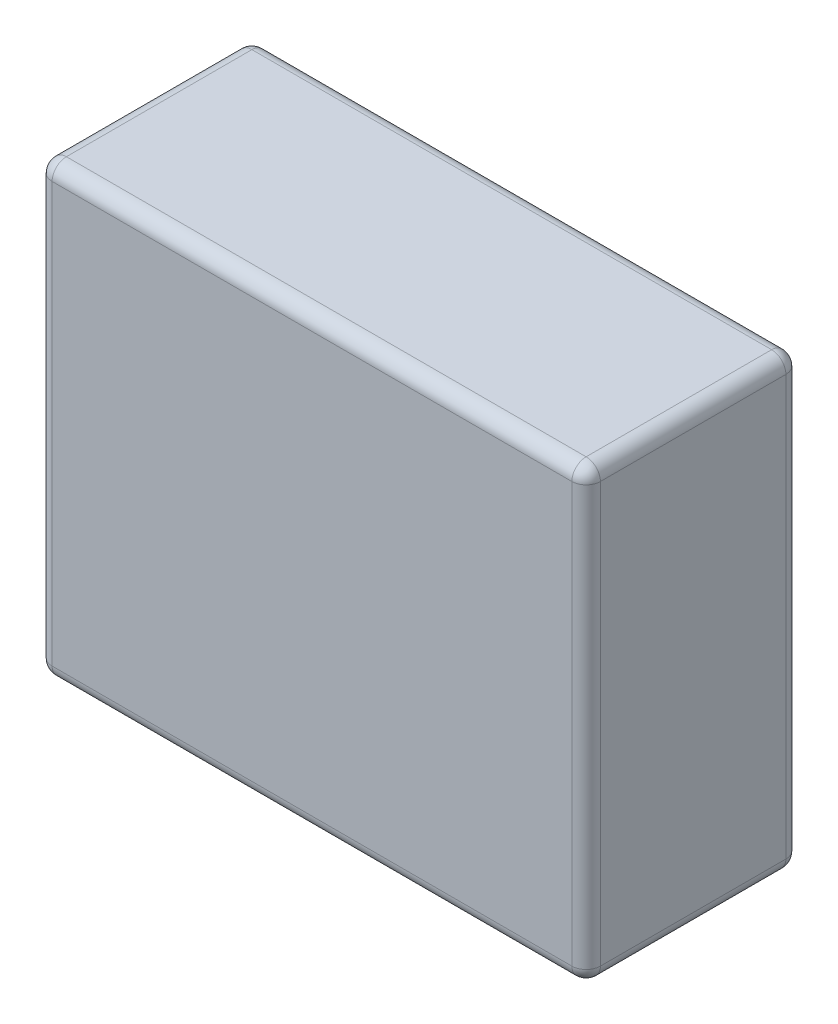
ISO-10303-21;
HEADER;
FILE_DESCRIPTION(('STEP AP214'),'2;1');
FILE_NAME('part.step','',(''),(''),'','','');
FILE_SCHEMA(('AUTOMOTIVE_DESIGN { 1 0 10303 214 1 1 1 1 }'));
ENDSEC;
DATA;
#1=APPLICATION_CONTEXT('core data for automotive mechanical design processes');
#2=APPLICATION_PROTOCOL_DEFINITION('international standard','automotive_design',2000,#1);
#3=PRODUCT_CONTEXT('',#1,'mechanical');
#4=PRODUCT('Part','Part','',(#3));
#5=PRODUCT_RELATED_PRODUCT_CATEGORY('part','',(#4));
#6=PRODUCT_DEFINITION_FORMATION('','',#4);
#7=PRODUCT_DEFINITION_CONTEXT('part definition',#1,'design');
#8=PRODUCT_DEFINITION('design','',#6,#7);
#9=PRODUCT_DEFINITION_SHAPE('','',#8);
#10=(LENGTH_UNIT() NAMED_UNIT(*) SI_UNIT(.MILLI.,.METRE.));
#11=(NAMED_UNIT(*) PLANE_ANGLE_UNIT() SI_UNIT($,.RADIAN.));
#12=(NAMED_UNIT(*) SI_UNIT($,.STERADIAN.) SOLID_ANGLE_UNIT());
#13=UNCERTAINTY_MEASURE_WITH_UNIT(LENGTH_MEASURE(1.E-05),#10,'distance_accuracy_value','');
#14=(GEOMETRIC_REPRESENTATION_CONTEXT(3) GLOBAL_UNCERTAINTY_ASSIGNED_CONTEXT((#13)) GLOBAL_UNIT_ASSIGNED_CONTEXT((#10,
#11,#12)) REPRESENTATION_CONTEXT('',''));
#15=CARTESIAN_POINT('',(0.,0.,0.));
#16=DIRECTION('',(0.,0.,1.));
#17=DIRECTION('',(1.,0.,0.));
#18=AXIS2_PLACEMENT_3D('',#15,#16,#17);
#19=CARTESIAN_POINT('',(0.,62.828734273791,30.));
#20=DIRECTION('',(1.,0.,0.));
#21=DIRECTION('',(0.,1.,0.));
#22=AXIS2_PLACEMENT_3D('',#19,#20,#21);
#23=PLANE('',#22);
#24=DIRECTION('',(0.,0.,-1.));
#25=VECTOR('',#24,1.);
#26=CARTESIAN_POINT('',(0.,2.6,2.99999999999999));
#27=LINE('',#26,#25);
#28=CARTESIAN_POINT('',(0.,2.6,2.99999999999999));
#29=VERTEX_POINT('',#28);
#30=CARTESIAN_POINT('',(0.,2.6,2.));
#31=VERTEX_POINT('',#30);
#32=EDGE_CURVE('E438',#29,#31,#27,.T.);
#33=ORIENTED_EDGE('',*,*,#32,.T.);
#34=DIRECTION('',(0.,-1.,0.));
#35=VECTOR('',#34,1.);
#36=CARTESIAN_POINT('',(0.,2.,2.));
#37=LINE('',#36,#35);
#38=CARTESIAN_POINT('',(0.,2.,2.));
#39=VERTEX_POINT('',#38);
#40=EDGE_CURVE('E327',#31,#39,#37,.T.);
#41=ORIENTED_EDGE('',*,*,#40,.T.);
#42=DIRECTION('',(0.,0.,-1.));
#43=VECTOR('',#42,1.);
#44=CARTESIAN_POINT('',(0.,2.,30.));
#45=LINE('',#44,#43);
#46=CARTESIAN_POINT('',(0.,2.,28.));
#47=VERTEX_POINT('',#46);
#48=EDGE_CURVE('E273',#39,#47,#45,.F.);
#49=ORIENTED_EDGE('',*,*,#48,.T.);
#50=DIRECTION('',(0.,-1.,0.));
#51=VECTOR('',#50,1.);
#52=CARTESIAN_POINT('',(0.,62.828734273791,28.));
#53=LINE('',#52,#51);
#54=CARTESIAN_POINT('',(0.,60.828734273791,28.));
#55=VERTEX_POINT('',#54);
#56=EDGE_CURVE('E377',#47,#55,#53,.F.);
#57=ORIENTED_EDGE('',*,*,#56,.T.);
#58=DIRECTION('',(0.,0.,-1.));
#59=VECTOR('',#58,1.);
#60=CARTESIAN_POINT('',(0.,60.828734273791,0.));
#61=LINE('',#60,#59);
#62=CARTESIAN_POINT('',(0.,60.828734273791,2.));
#63=VERTEX_POINT('',#62);
#64=EDGE_CURVE('E285',#55,#63,#61,.T.);
#65=ORIENTED_EDGE('',*,*,#64,.T.);
#66=CARTESIAN_POINT('',(0.,60.4,2.));
#67=VERTEX_POINT('',#66);
#68=EDGE_CURVE('E328',#63,#67,#37,.T.);
#69=ORIENTED_EDGE('',*,*,#68,.T.);
#70=DIRECTION('',(0.,0.,-1.));
#71=VECTOR('',#70,1.);
#72=CARTESIAN_POINT('',(0.,60.4,3.));
#73=LINE('',#72,#71);
#74=CARTESIAN_POINT('',(0.,60.4,3.));
#75=VERTEX_POINT('',#74);
#76=EDGE_CURVE('E219',#75,#67,#73,.T.);
#77=ORIENTED_EDGE('',*,*,#76,.F.);
#78=DIRECTION('',(0.,-1.,0.));
#79=VECTOR('',#78,1.);
#80=CARTESIAN_POINT('',(0.,59.,3.));
#81=LINE('',#80,#79);
#82=EDGE_CURVE('E243',#75,#29,#81,.T.);
#83=ORIENTED_EDGE('',*,*,#82,.T.);
#84=EDGE_LOOP('',(#33,#41,#49,#57,#65,#69,#77,#83));
#85=FACE_BOUND('',#84,.T.);
#86=ADVANCED_FACE('F35',(#85),#23,.F.);
#87=CARTESIAN_POINT('',(2.,62.828734273791,2.));
#88=DIRECTION('',(0.,1.,0.));
#89=DIRECTION('',(-1.,0.,0.));
#90=AXIS2_PLACEMENT_3D('',#87,#88,#89);
#91=CYLINDRICAL_SURFACE('',#90,2.);
#92=ORIENTED_EDGE('',*,*,#40,.F.);
#93=CARTESIAN_POINT('',(2.,2.6,2.));
#94=DIRECTION('',(0.,1.,0.));
#95=DIRECTION('',(0.,0.,1.));
#96=AXIS2_PLACEMENT_3D('',#93,#94,#95);
#97=CIRCLE('',#96,2.);
#98=CARTESIAN_POINT('',(0.0921215971661088,2.6,1.4));
#99=VERTEX_POINT('',#98);
#100=EDGE_CURVE('E11',#31,#99,#97,.F.);
#101=ORIENTED_EDGE('',*,*,#100,.T.);
#102=DIRECTION('',(0.,1.,0.));
#103=VECTOR('',#102,1.);
#104=CARTESIAN_POINT('',(0.0921215971661092,62.828734273791,1.4));
#105=LINE('',#104,#103);
#106=CARTESIAN_POINT('',(0.0921215971661088,4.,1.4));
#107=VERTEX_POINT('',#106);
#108=EDGE_CURVE('E223',#107,#99,#105,.F.);
#109=ORIENTED_EDGE('',*,*,#108,.F.);
#110=CARTESIAN_POINT('',(2.,4.,2.));
#111=DIRECTION('',(0.,1.,0.));
#112=DIRECTION('',(0.,0.,1.));
#113=AXIS2_PLACEMENT_3D('',#110,#111,#112);
#114=CIRCLE('',#113,2.);
#115=CARTESIAN_POINT('',(2.,4.,0.));
#116=VERTEX_POINT('',#115);
#117=EDGE_CURVE('E409',#107,#116,#114,.F.);
#118=ORIENTED_EDGE('',*,*,#117,.T.);
#119=DIRECTION('',(0.,-1.,0.));
#120=VECTOR('',#119,1.);
#121=CARTESIAN_POINT('',(2.,60.828734273791,0.));
#122=LINE('',#121,#120);
#123=CARTESIAN_POINT('',(2.,2.,0.));
#124=VERTEX_POINT('',#123);
#125=EDGE_CURVE('E321',#124,#116,#122,.F.);
#126=ORIENTED_EDGE('',*,*,#125,.F.);
#127=CARTESIAN_POINT('',(2.,2.,2.));
#128=DIRECTION('',(0.,1.,0.));
#129=DIRECTION('',(-1.,0.,0.));
#130=AXIS2_PLACEMENT_3D('',#127,#128,#129);
#131=CIRCLE('',#130,2.);
#132=EDGE_CURVE('E265',#124,#39,#131,.T.);
#133=ORIENTED_EDGE('',*,*,#132,.T.);
#134=EDGE_LOOP('',(#92,#101,#109,#118,#126,#133));
#135=FACE_BOUND('',#134,.T.);
#136=ADVANCED_FACE('F436',(#135),#91,.T.);
#137=CARTESIAN_POINT('',(4.,59.,26.));
#138=DIRECTION('',(0.,1.,0.));
#139=DIRECTION('',(0.,0.,1.));
#140=AXIS2_PLACEMENT_3D('',#137,#138,#139);
#141=PLANE('',#140);
#142=DIRECTION('',(-1.,0.,0.));
#143=VECTOR('',#142,1.);
#144=CARTESIAN_POINT('',(4.,59.,3.));
#145=LINE('',#144,#143);
#146=CARTESIAN_POINT('',(73.,59.,3.));
#147=VERTEX_POINT('',#146);
#148=CARTESIAN_POINT('',(4.,59.,3.));
#149=VERTEX_POINT('',#148);
#150=EDGE_CURVE('E227',#147,#149,#145,.T.);
#151=ORIENTED_EDGE('',*,*,#150,.F.);
#152=DIRECTION('',(0.,0.,-1.));
#153=VECTOR('',#152,1.);
#154=CARTESIAN_POINT('',(73.,59.,26.));
#155=LINE('',#154,#153);
#156=CARTESIAN_POINT('',(73.,59.,26.));
#157=VERTEX_POINT('',#156);
#158=EDGE_CURVE('E280',#157,#147,#155,.T.);
#159=ORIENTED_EDGE('',*,*,#158,.F.);
#160=DIRECTION('',(1.,0.,0.));
#161=VECTOR('',#160,1.);
#162=CARTESIAN_POINT('',(4.,59.,26.));
#163=LINE('',#162,#161);
#164=CARTESIAN_POINT('',(4.,59.,26.));
#165=VERTEX_POINT('',#164);
#166=EDGE_CURVE('E249',#165,#157,#163,.T.);
#167=ORIENTED_EDGE('',*,*,#166,.F.);
#168=DIRECTION('',(0.,0.,-1.));
#169=VECTOR('',#168,1.);
#170=CARTESIAN_POINT('',(4.,59.,26.));
#171=LINE('',#170,#169);
#172=EDGE_CURVE('E270',#165,#149,#171,.T.);
#173=ORIENTED_EDGE('',*,*,#172,.T.);
#174=EDGE_LOOP('',(#151,#159,#167,#173));
#175=FACE_BOUND('',#174,.T.);
#176=ADVANCED_FACE('F523',(#175),#141,.F.);
#177=CARTESIAN_POINT('',(4.,4.,26.));
#178=DIRECTION('',(0.,1.,0.));
#179=DIRECTION('',(0.,0.,1.));
#180=AXIS2_PLACEMENT_3D('',#177,#178,#179);
#181=PLANE('',#180);
#182=DIRECTION('',(0.,0.,-1.));
#183=VECTOR('',#182,1.);
#184=CARTESIAN_POINT('',(73.,4.,26.));
#185=LINE('',#184,#183);
#186=CARTESIAN_POINT('',(73.,4.,26.));
#187=VERTEX_POINT('',#186);
#188=CARTESIAN_POINT('',(73.,4.,3.));
#189=VERTEX_POINT('',#188);
#190=EDGE_CURVE('E277',#187,#189,#185,.T.);
#191=ORIENTED_EDGE('',*,*,#190,.T.);
#192=DIRECTION('',(-1.,0.,0.));
#193=VECTOR('',#192,1.);
#194=CARTESIAN_POINT('',(4.,4.,2.99999999999999));
#195=LINE('',#194,#193);
#196=CARTESIAN_POINT('',(4.,4.,2.99999999999999));
#197=VERTEX_POINT('',#196);
#198=EDGE_CURVE('E224',#189,#197,#195,.T.);
#199=ORIENTED_EDGE('',*,*,#198,.T.);
#200=DIRECTION('',(0.,0.,-1.));
#201=VECTOR('',#200,1.);
#202=CARTESIAN_POINT('',(4.,4.,26.));
#203=LINE('',#202,#201);
#204=CARTESIAN_POINT('',(4.,4.,26.));
#205=VERTEX_POINT('',#204);
#206=EDGE_CURVE('E274',#205,#197,#203,.T.);
#207=ORIENTED_EDGE('',*,*,#206,.F.);
#208=DIRECTION('',(1.,0.,0.));
#209=VECTOR('',#208,1.);
#210=CARTESIAN_POINT('',(4.,4.,26.));
#211=LINE('',#210,#209);
#212=EDGE_CURVE('E255',#205,#187,#211,.T.);
#213=ORIENTED_EDGE('',*,*,#212,.T.);
#214=EDGE_LOOP('',(#191,#199,#207,#213));
#215=FACE_BOUND('',#214,.T.);
#216=ADVANCED_FACE('F603',(#215),#181,.T.);
#217=CARTESIAN_POINT('',(0.,0.,0.));
#218=DIRECTION('',(0.,0.,-1.));
#219=DIRECTION('',(-1.,0.,0.));
#220=AXIS2_PLACEMENT_3D('',#217,#218,#219);
#221=PLANE('',#220);
#222=ORIENTED_EDGE('',*,*,#125,.T.);
#223=DIRECTION('',(1.,0.,0.));
#224=VECTOR('',#223,1.);
#225=CARTESIAN_POINT('',(4.,4.,0.));
#226=LINE('',#225,#224);
#227=CARTESIAN_POINT('',(73.,4.,0.));
#228=VERTEX_POINT('',#227);
#229=EDGE_CURVE('E253',#116,#228,#226,.T.);
#230=ORIENTED_EDGE('',*,*,#229,.T.);
#231=DIRECTION('',(0.,1.,0.));
#232=VECTOR('',#231,1.);
#233=CARTESIAN_POINT('',(73.,4.,0.));
#234=LINE('',#233,#232);
#235=CARTESIAN_POINT('',(73.,59.,0.));
#236=VERTEX_POINT('',#235);
#237=EDGE_CURVE('E264',#228,#236,#234,.T.);
#238=ORIENTED_EDGE('',*,*,#237,.T.);
#239=DIRECTION('',(1.,0.,0.));
#240=VECTOR('',#239,1.);
#241=CARTESIAN_POINT('',(4.,59.,0.));
#242=LINE('',#241,#240);
#243=CARTESIAN_POINT('',(2.,59.,0.));
#244=VERTEX_POINT('',#243);
#245=EDGE_CURVE('E261',#244,#236,#242,.T.);
#246=ORIENTED_EDGE('',*,*,#245,.F.);
#247=CARTESIAN_POINT('',(2.,60.828734273791,0.));
#248=VERTEX_POINT('',#247);
#249=EDGE_CURVE('E320',#244,#248,#122,.F.);
#250=ORIENTED_EDGE('',*,*,#249,.T.);
#251=DIRECTION('',(1.,0.,0.));
#252=VECTOR('',#251,1.);
#253=CARTESIAN_POINT('',(0.,60.828734273791,0.));
#254=LINE('',#253,#252);
#255=CARTESIAN_POINT('',(74.8517622124094,60.828734273791,0.));
#256=VERTEX_POINT('',#255);
#257=EDGE_CURVE('E318',#248,#256,#254,.T.);
#258=ORIENTED_EDGE('',*,*,#257,.T.);
#259=DIRECTION('',(0.,-1.,0.));
#260=VECTOR('',#259,1.);
#261=CARTESIAN_POINT('',(74.8517622124094,0.,0.));
#262=LINE('',#261,#260);
#263=CARTESIAN_POINT('',(74.8517622124094,2.,0.));
#264=VERTEX_POINT('',#263);
#265=EDGE_CURVE('E316',#256,#264,#262,.T.);
#266=ORIENTED_EDGE('',*,*,#265,.T.);
#267=DIRECTION('',(1.,0.,0.));
#268=VECTOR('',#267,1.);
#269=CARTESIAN_POINT('',(2.,2.,0.));
#270=LINE('',#269,#268);
#271=EDGE_CURVE('E324',#264,#124,#270,.F.);
#272=ORIENTED_EDGE('',*,*,#271,.T.);
#273=EDGE_LOOP('',(#222,#230,#238,#246,#250,#258,#266,#272));
#274=FACE_BOUND('',#273,.T.);
#275=ADVANCED_FACE('F429',(#274),#221,.T.);
#276=CARTESIAN_POINT('',(4.,4.,26.));
#277=DIRECTION('',(-1.,0.,0.));
#278=DIRECTION('',(0.,0.,1.));
#279=AXIS2_PLACEMENT_3D('',#276,#277,#278);
#280=PLANE('',#279);
#281=DIRECTION('',(0.,-1.,0.));
#282=VECTOR('',#281,1.);
#283=CARTESIAN_POINT('',(4.,4.,2.99999999999999));
#284=LINE('',#283,#282);
#285=EDGE_CURVE('E245',#149,#197,#284,.T.);
#286=ORIENTED_EDGE('',*,*,#285,.F.);
#287=ORIENTED_EDGE('',*,*,#172,.F.);
#288=DIRECTION('',(0.,1.,0.));
#289=VECTOR('',#288,1.);
#290=CARTESIAN_POINT('',(4.,4.,26.));
#291=LINE('',#290,#289);
#292=EDGE_CURVE('E257',#205,#165,#291,.T.);
#293=ORIENTED_EDGE('',*,*,#292,.F.);
#294=ORIENTED_EDGE('',*,*,#206,.T.);
#295=EDGE_LOOP('',(#286,#287,#293,#294));
#296=FACE_BOUND('',#295,.T.);
#297=ADVANCED_FACE('F604',(#296),#280,.F.);
#298=DIRECTION('',(0.,1.,0.));
#299=VECTOR('',#298,1.);
#300=CARTESIAN_POINT('',(0.0921215971661092,62.828734273791,1.4));
#301=LINE('',#300,#299);
#302=CARTESIAN_POINT('',(0.0921215971661092,60.4,1.4));
#303=VERTEX_POINT('',#302);
#304=CARTESIAN_POINT('',(0.0921215971661088,59.,1.4));
#305=VERTEX_POINT('',#304);
#306=EDGE_CURVE('E241',#303,#305,#301,.F.);
#307=ORIENTED_EDGE('',*,*,#306,.F.);
#308=CARTESIAN_POINT('',(2.,60.4,2.));
#309=DIRECTION('',(0.,1.,0.));
#310=DIRECTION('',(0.,0.,1.));
#311=AXIS2_PLACEMENT_3D('',#308,#309,#310);
#312=CIRCLE('',#311,2.);
#313=EDGE_CURVE('E43',#67,#303,#312,.F.);
#314=ORIENTED_EDGE('',*,*,#313,.F.);
#315=ORIENTED_EDGE('',*,*,#68,.F.);
#316=CARTESIAN_POINT('',(2.,60.828734273791,2.));
#317=DIRECTION('',(0.,1.,0.));
#318=DIRECTION('',(0.,0.,1.));
#319=AXIS2_PLACEMENT_3D('',#316,#317,#318);
#320=CIRCLE('',#319,2.);
#321=EDGE_CURVE('E352',#248,#63,#320,.T.);
#322=ORIENTED_EDGE('',*,*,#321,.F.);
#323=ORIENTED_EDGE('',*,*,#249,.F.);
#324=CARTESIAN_POINT('',(2.,59.,2.));
#325=DIRECTION('',(0.,-1.,0.));
#326=DIRECTION('',(0.,0.,-1.));
#327=AXIS2_PLACEMENT_3D('',#324,#325,#326);
#328=CIRCLE('',#327,2.);
#329=EDGE_CURVE('E385',#244,#305,#328,.F.);
#330=ORIENTED_EDGE('',*,*,#329,.T.);
#331=EDGE_LOOP('',(#307,#314,#315,#322,#323,#330));
#332=FACE_BOUND('',#331,.T.);
#333=ADVANCED_FACE('F421',(#332),#91,.T.);
#334=CARTESIAN_POINT('',(0.,0.,30.));
#335=DIRECTION('',(0.,1.,0.));
#336=DIRECTION('',(-1.,0.,0.));
#337=AXIS2_PLACEMENT_3D('',#334,#335,#336);
#338=PLANE('',#337);
#339=DIRECTION('',(0.,0.,-1.));
#340=VECTOR('',#339,1.);
#341=CARTESIAN_POINT('',(74.8517622124094,0.,30.));
#342=LINE('',#341,#340);
#343=CARTESIAN_POINT('',(74.8517622124094,0.,2.));
#344=VERTEX_POINT('',#343);
#345=CARTESIAN_POINT('',(74.8517622124094,0.,28.));
#346=VERTEX_POINT('',#345);
#347=EDGE_CURVE('E292',#344,#346,#342,.F.);
#348=ORIENTED_EDGE('',*,*,#347,.T.);
#349=DIRECTION('',(1.,0.,0.));
#350=VECTOR('',#349,1.);
#351=CARTESIAN_POINT('',(0.,0.,28.));
#352=LINE('',#351,#350);
#353=CARTESIAN_POINT('',(2.,0.,28.));
#354=VERTEX_POINT('',#353);
#355=EDGE_CURVE('E381',#346,#354,#352,.F.);
#356=ORIENTED_EDGE('',*,*,#355,.T.);
#357=DIRECTION('',(0.,0.,-1.));
#358=VECTOR('',#357,1.);
#359=CARTESIAN_POINT('',(2.,0.,30.));
#360=LINE('',#359,#358);
#361=CARTESIAN_POINT('',(2.,0.,2.));
#362=VERTEX_POINT('',#361);
#363=EDGE_CURVE('E295',#354,#362,#360,.T.);
#364=ORIENTED_EDGE('',*,*,#363,.T.);
#365=DIRECTION('',(1.,0.,0.));
#366=VECTOR('',#365,1.);
#367=CARTESIAN_POINT('',(74.8517622124094,0.,2.));
#368=LINE('',#367,#366);
#369=EDGE_CURVE('E314',#362,#344,#368,.T.);
#370=ORIENTED_EDGE('',*,*,#369,.T.);
#371=EDGE_LOOP('',(#348,#356,#364,#370));
#372=FACE_BOUND('',#371,.T.);
#373=ADVANCED_FACE('F534',(#372),#338,.F.);
#374=CARTESIAN_POINT('',(76.8517622124094,62.828734273791,30.));
#375=DIRECTION('',(1.,0.,0.));
#376=DIRECTION('',(0.,1.,0.));
#377=AXIS2_PLACEMENT_3D('',#374,#375,#376);
#378=PLANE('',#377);
#379=DIRECTION('',(0.,0.,-1.));
#380=VECTOR('',#379,1.);
#381=CARTESIAN_POINT('',(76.8517622124094,60.828734273791,30.));
#382=LINE('',#381,#380);
#383=CARTESIAN_POINT('',(76.8517622124094,60.828734273791,2.));
#384=VERTEX_POINT('',#383);
#385=CARTESIAN_POINT('',(76.8517622124094,60.828734273791,28.));
#386=VERTEX_POINT('',#385);
#387=EDGE_CURVE('E297',#384,#386,#382,.F.);
#388=ORIENTED_EDGE('',*,*,#387,.T.);
#389=DIRECTION('',(0.,-1.,0.));
#390=VECTOR('',#389,1.);
#391=CARTESIAN_POINT('',(76.8517622124094,2.,28.));
#392=LINE('',#391,#390);
#393=CARTESIAN_POINT('',(76.8517622124094,2.,28.));
#394=VERTEX_POINT('',#393);
#395=EDGE_CURVE('E383',#386,#394,#392,.T.);
#396=ORIENTED_EDGE('',*,*,#395,.T.);
#397=DIRECTION('',(0.,0.,-1.));
#398=VECTOR('',#397,1.);
#399=CARTESIAN_POINT('',(76.8517622124094,2.,0.));
#400=LINE('',#399,#398);
#401=CARTESIAN_POINT('',(76.8517622124094,2.,2.));
#402=VERTEX_POINT('',#401);
#403=EDGE_CURVE('E300',#394,#402,#400,.T.);
#404=ORIENTED_EDGE('',*,*,#403,.T.);
#405=DIRECTION('',(0.,-1.,0.));
#406=VECTOR('',#405,1.);
#407=CARTESIAN_POINT('',(76.8517622124094,62.828734273791,2.));
#408=LINE('',#407,#406);
#409=EDGE_CURVE('E333',#402,#384,#408,.F.);
#410=ORIENTED_EDGE('',*,*,#409,.T.);
#411=EDGE_LOOP('',(#388,#396,#404,#410));
#412=FACE_BOUND('',#411,.T.);
#413=ADVANCED_FACE('F531',(#412),#378,.T.);
#414=CARTESIAN_POINT('',(0.,62.828734273791,30.));
#415=DIRECTION('',(0.,1.,0.));
#416=DIRECTION('',(0.,0.,1.));
#417=AXIS2_PLACEMENT_3D('',#414,#415,#416);
#418=PLANE('',#417);
#419=DIRECTION('',(0.,0.,-1.));
#420=VECTOR('',#419,1.);
#421=CARTESIAN_POINT('',(2.,62.828734273791,30.));
#422=LINE('',#421,#420);
#423=CARTESIAN_POINT('',(2.,62.828734273791,2.));
#424=VERTEX_POINT('',#423);
#425=CARTESIAN_POINT('',(2.,62.828734273791,28.));
#426=VERTEX_POINT('',#425);
#427=EDGE_CURVE('E289',#424,#426,#422,.F.);
#428=ORIENTED_EDGE('',*,*,#427,.T.);
#429=DIRECTION('',(1.,0.,0.));
#430=VECTOR('',#429,1.);
#431=CARTESIAN_POINT('',(74.8517622124094,62.828734273791,28.));
#432=LINE('',#431,#430);
#433=CARTESIAN_POINT('',(74.8517622124094,62.828734273791,28.));
#434=VERTEX_POINT('',#433);
#435=EDGE_CURVE('E379',#426,#434,#432,.T.);
#436=ORIENTED_EDGE('',*,*,#435,.T.);
#437=DIRECTION('',(0.,0.,-1.));
#438=VECTOR('',#437,1.);
#439=CARTESIAN_POINT('',(74.8517622124094,62.828734273791,30.));
#440=LINE('',#439,#438);
#441=CARTESIAN_POINT('',(74.8517622124094,62.828734273791,2.));
#442=VERTEX_POINT('',#441);
#443=EDGE_CURVE('E287',#434,#442,#440,.T.);
#444=ORIENTED_EDGE('',*,*,#443,.T.);
#445=DIRECTION('',(1.,0.,0.));
#446=VECTOR('',#445,1.);
#447=CARTESIAN_POINT('',(0.,62.828734273791,2.));
#448=LINE('',#447,#446);
#449=EDGE_CURVE('E331',#442,#424,#448,.F.);
#450=ORIENTED_EDGE('',*,*,#449,.T.);
#451=EDGE_LOOP('',(#428,#436,#444,#450));
#452=FACE_BOUND('',#451,.T.);
#453=ADVANCED_FACE('F500',(#452),#418,.T.);
#454=CARTESIAN_POINT('',(0.,0.,30.));
#455=DIRECTION('',(0.,0.,-1.));
#456=DIRECTION('',(-1.,0.,0.));
#457=AXIS2_PLACEMENT_3D('',#454,#455,#456);
#458=PLANE('',#457);
#459=DIRECTION('',(1.,0.,0.));
#460=VECTOR('',#459,1.);
#461=CARTESIAN_POINT('',(2.,60.828734273791,30.));
#462=LINE('',#461,#460);
#463=CARTESIAN_POINT('',(74.8517622124094,60.828734273791,30.));
#464=VERTEX_POINT('',#463);
#465=CARTESIAN_POINT('',(2.,60.828734273791,30.));
#466=VERTEX_POINT('',#465);
#467=EDGE_CURVE('E372',#464,#466,#462,.F.);
#468=ORIENTED_EDGE('',*,*,#467,.T.);
#469=DIRECTION('',(0.,-1.,0.));
#470=VECTOR('',#469,1.);
#471=CARTESIAN_POINT('',(2.,0.,30.));
#472=LINE('',#471,#470);
#473=CARTESIAN_POINT('',(2.,2.,30.));
#474=VERTEX_POINT('',#473);
#475=EDGE_CURVE('E374',#466,#474,#472,.T.);
#476=ORIENTED_EDGE('',*,*,#475,.T.);
#477=DIRECTION('',(1.,0.,0.));
#478=VECTOR('',#477,1.);
#479=CARTESIAN_POINT('',(0.,2.,30.));
#480=LINE('',#479,#478);
#481=CARTESIAN_POINT('',(74.8517622124094,2.,30.));
#482=VERTEX_POINT('',#481);
#483=EDGE_CURVE('E370',#474,#482,#480,.T.);
#484=ORIENTED_EDGE('',*,*,#483,.T.);
#485=DIRECTION('',(0.,-1.,0.));
#486=VECTOR('',#485,1.);
#487=CARTESIAN_POINT('',(74.8517622124094,60.828734273791,30.));
#488=LINE('',#487,#486);
#489=EDGE_CURVE('E368',#482,#464,#488,.F.);
#490=ORIENTED_EDGE('',*,*,#489,.T.);
#491=EDGE_LOOP('',(#468,#476,#484,#490));
#492=FACE_BOUND('',#491,.T.);
#493=ADVANCED_FACE('F530',(#492),#458,.F.);
#494=CARTESIAN_POINT('',(73.,59.,1.40000000000001));
#495=VERTEX_POINT('',#494);
#496=EDGE_CURVE('E260',#495,#236,#155,.T.);
#497=ORIENTED_EDGE('',*,*,#496,.F.);
#498=DIRECTION('',(-1.,0.,0.));
#499=VECTOR('',#498,1.);
#500=CARTESIAN_POINT('',(4.,59.,1.4));
#501=LINE('',#500,#499);
#502=EDGE_CURVE('E238',#495,#305,#501,.T.);
#503=ORIENTED_EDGE('',*,*,#502,.T.);
#504=ORIENTED_EDGE('',*,*,#329,.F.);
#505=ORIENTED_EDGE('',*,*,#245,.T.);
#506=EDGE_LOOP('',(#497,#503,#504,#505));
#507=FACE_BOUND('',#506,.T.);
#508=ADVANCED_FACE('F427',(#507),#141,.F.);
#509=DIRECTION('',(-1.,0.,0.));
#510=VECTOR('',#509,1.);
#511=CARTESIAN_POINT('',(4.,4.,1.4));
#512=LINE('',#511,#510);
#513=CARTESIAN_POINT('',(73.,4.,1.4));
#514=VERTEX_POINT('',#513);
#515=EDGE_CURVE('E235',#514,#107,#512,.T.);
#516=ORIENTED_EDGE('',*,*,#515,.F.);
#517=EDGE_CURVE('E206',#514,#228,#185,.T.);
#518=ORIENTED_EDGE('',*,*,#517,.T.);
#519=ORIENTED_EDGE('',*,*,#229,.F.);
#520=ORIENTED_EDGE('',*,*,#117,.F.);
#521=EDGE_LOOP('',(#516,#518,#519,#520));
#522=FACE_BOUND('',#521,.T.);
#523=ADVANCED_FACE('F433',(#522),#181,.T.);
#524=CARTESIAN_POINT('',(73.,4.,26.));
#525=DIRECTION('',(-1.,0.,0.));
#526=DIRECTION('',(0.,0.,1.));
#527=AXIS2_PLACEMENT_3D('',#524,#525,#526);
#528=PLANE('',#527);
#529=ORIENTED_EDGE('',*,*,#517,.F.);
#530=DIRECTION('',(0.,-1.,0.));
#531=VECTOR('',#530,1.);
#532=CARTESIAN_POINT('',(73.,60.4,1.4));
#533=LINE('',#532,#531);
#534=CARTESIAN_POINT('',(73.,2.6,1.4));
#535=VERTEX_POINT('',#534);
#536=EDGE_CURVE('E201',#514,#535,#533,.T.);
#537=ORIENTED_EDGE('',*,*,#536,.T.);
#538=DIRECTION('',(0.,0.,-1.));
#539=VECTOR('',#538,1.);
#540=CARTESIAN_POINT('',(73.,2.6,2.99999999999999));
#541=LINE('',#540,#539);
#542=CARTESIAN_POINT('',(73.,2.6,2.99999999999999));
#543=VERTEX_POINT('',#542);
#544=EDGE_CURVE('E204',#543,#535,#541,.T.);
#545=ORIENTED_EDGE('',*,*,#544,.F.);
#546=DIRECTION('',(0.,-1.,0.));
#547=VECTOR('',#546,1.);
#548=CARTESIAN_POINT('',(73.,60.4,3.));
#549=LINE('',#548,#547);
#550=EDGE_CURVE('E57',#189,#543,#549,.T.);
#551=ORIENTED_EDGE('',*,*,#550,.F.);
#552=ORIENTED_EDGE('',*,*,#190,.F.);
#553=DIRECTION('',(0.,1.,0.));
#554=VECTOR('',#553,1.);
#555=CARTESIAN_POINT('',(73.,4.,26.));
#556=LINE('',#555,#554);
#557=EDGE_CURVE('E252',#187,#157,#556,.T.);
#558=ORIENTED_EDGE('',*,*,#557,.T.);
#559=ORIENTED_EDGE('',*,*,#158,.T.);
#560=CARTESIAN_POINT('',(73.,60.4,3.));
#561=VERTEX_POINT('',#560);
#562=EDGE_CURVE('E444',#561,#147,#549,.T.);
#563=ORIENTED_EDGE('',*,*,#562,.F.);
#564=DIRECTION('',(0.,0.,-1.));
#565=VECTOR('',#564,1.);
#566=CARTESIAN_POINT('',(73.,60.4,3.));
#567=LINE('',#566,#565);
#568=CARTESIAN_POINT('',(73.,60.4,1.4));
#569=VERTEX_POINT('',#568);
#570=EDGE_CURVE('E447',#561,#569,#567,.T.);
#571=ORIENTED_EDGE('',*,*,#570,.T.);
#572=EDGE_CURVE('E50',#569,#495,#533,.T.);
#573=ORIENTED_EDGE('',*,*,#572,.T.);
#574=ORIENTED_EDGE('',*,*,#496,.T.);
#575=ORIENTED_EDGE('',*,*,#237,.F.);
#576=EDGE_LOOP('',(#529,#537,#545,#551,#552,#558,#559,#563,#571,#573,#574,#575));
#577=FACE_BOUND('',#576,.T.);
#578=ADVANCED_FACE('F203',(#577),#528,.T.);
#579=CARTESIAN_POINT('',(0.,0.,26.));
#580=DIRECTION('',(0.,0.,1.));
#581=DIRECTION('',(1.,0.,0.));
#582=AXIS2_PLACEMENT_3D('',#579,#580,#581);
#583=PLANE('',#582);
#584=ORIENTED_EDGE('',*,*,#166,.T.);
#585=ORIENTED_EDGE('',*,*,#557,.F.);
#586=ORIENTED_EDGE('',*,*,#212,.F.);
#587=ORIENTED_EDGE('',*,*,#292,.T.);
#588=EDGE_LOOP('',(#584,#585,#586,#587));
#589=FACE_BOUND('',#588,.T.);
#590=ADVANCED_FACE('F541',(#589),#583,.F.);
#591=CARTESIAN_POINT('',(2.,60.828734273791,30.));
#592=DIRECTION('',(0.,0.,1.));
#593=DIRECTION('',(1.,0.,0.));
#594=AXIS2_PLACEMENT_3D('',#591,#592,#593);
#595=CYLINDRICAL_SURFACE('',#594,2.);
#596=ORIENTED_EDGE('',*,*,#64,.F.);
#597=CARTESIAN_POINT('',(2.,60.828734273791,28.));
#598=DIRECTION('',(0.,0.,1.));
#599=DIRECTION('',(1.,0.,0.));
#600=AXIS2_PLACEMENT_3D('',#597,#598,#599);
#601=CIRCLE('',#600,2.);
#602=EDGE_CURVE('E362',#55,#426,#601,.F.);
#603=ORIENTED_EDGE('',*,*,#602,.T.);
#604=ORIENTED_EDGE('',*,*,#427,.F.);
#605=CARTESIAN_POINT('',(2.,60.828734273791,2.));
#606=DIRECTION('',(0.,0.,1.));
#607=DIRECTION('',(1.,0.,0.));
#608=AXIS2_PLACEMENT_3D('',#605,#606,#607);
#609=CIRCLE('',#608,2.);
#610=EDGE_CURVE('E305',#424,#63,#609,.T.);
#611=ORIENTED_EDGE('',*,*,#610,.T.);
#612=EDGE_LOOP('',(#596,#603,#604,#611));
#613=FACE_BOUND('',#612,.T.);
#614=ADVANCED_FACE('F498',(#613),#595,.T.);
#615=CARTESIAN_POINT('',(2.,2.,30.));
#616=DIRECTION('',(0.,0.,-1.));
#617=DIRECTION('',(-1.,0.,0.));
#618=AXIS2_PLACEMENT_3D('',#615,#616,#617);
#619=CYLINDRICAL_SURFACE('',#618,2.);
#620=ORIENTED_EDGE('',*,*,#363,.F.);
#621=CARTESIAN_POINT('',(2.,2.,28.));
#622=DIRECTION('',(0.,0.,-1.));
#623=DIRECTION('',(-1.,0.,0.));
#624=AXIS2_PLACEMENT_3D('',#621,#622,#623);
#625=CIRCLE('',#624,2.);
#626=EDGE_CURVE('E364',#354,#47,#625,.T.);
#627=ORIENTED_EDGE('',*,*,#626,.T.);
#628=ORIENTED_EDGE('',*,*,#48,.F.);
#629=CARTESIAN_POINT('',(2.,2.,2.));
#630=DIRECTION('',(0.,0.,-1.));
#631=DIRECTION('',(-1.,0.,0.));
#632=AXIS2_PLACEMENT_3D('',#629,#630,#631);
#633=CIRCLE('',#632,2.);
#634=EDGE_CURVE('E308',#39,#362,#633,.F.);
#635=ORIENTED_EDGE('',*,*,#634,.T.);
#636=EDGE_LOOP('',(#620,#627,#628,#635));
#637=FACE_BOUND('',#636,.T.);
#638=ADVANCED_FACE('F481',(#637),#619,.T.);
#639=CARTESIAN_POINT('',(74.8517622124094,2.,30.));
#640=DIRECTION('',(0.,0.,1.));
#641=DIRECTION('',(1.,0.,0.));
#642=AXIS2_PLACEMENT_3D('',#639,#640,#641);
#643=CYLINDRICAL_SURFACE('',#642,2.);
#644=ORIENTED_EDGE('',*,*,#403,.F.);
#645=CARTESIAN_POINT('',(74.8517622124094,2.,28.));
#646=DIRECTION('',(0.,0.,1.));
#647=DIRECTION('',(1.,0.,0.));
#648=AXIS2_PLACEMENT_3D('',#645,#646,#647);
#649=CIRCLE('',#648,2.);
#650=EDGE_CURVE('E366',#394,#346,#649,.F.);
#651=ORIENTED_EDGE('',*,*,#650,.T.);
#652=ORIENTED_EDGE('',*,*,#347,.F.);
#653=CARTESIAN_POINT('',(74.8517622124094,2.,2.));
#654=DIRECTION('',(0.,0.,1.));
#655=DIRECTION('',(1.,0.,0.));
#656=AXIS2_PLACEMENT_3D('',#653,#654,#655);
#657=CIRCLE('',#656,2.);
#658=EDGE_CURVE('E311',#344,#402,#657,.T.);
#659=ORIENTED_EDGE('',*,*,#658,.T.);
#660=EDGE_LOOP('',(#644,#651,#652,#659));
#661=FACE_BOUND('',#660,.T.);
#662=ADVANCED_FACE('F544',(#661),#643,.T.);
#663=CARTESIAN_POINT('',(74.8517622124094,60.828734273791,30.));
#664=DIRECTION('',(0.,0.,-1.));
#665=DIRECTION('',(-1.,0.,0.));
#666=AXIS2_PLACEMENT_3D('',#663,#664,#665);
#667=CYLINDRICAL_SURFACE('',#666,2.);
#668=ORIENTED_EDGE('',*,*,#443,.F.);
#669=CARTESIAN_POINT('',(74.8517622124094,60.828734273791,28.));
#670=DIRECTION('',(0.,0.,-1.));
#671=DIRECTION('',(-1.,0.,0.));
#672=AXIS2_PLACEMENT_3D('',#669,#670,#671);
#673=CIRCLE('',#672,2.);
#674=EDGE_CURVE('E335',#434,#386,#673,.T.);
#675=ORIENTED_EDGE('',*,*,#674,.T.);
#676=ORIENTED_EDGE('',*,*,#387,.F.);
#677=CARTESIAN_POINT('',(74.8517622124094,60.828734273791,2.));
#678=DIRECTION('',(0.,0.,-1.));
#679=DIRECTION('',(-1.,0.,0.));
#680=AXIS2_PLACEMENT_3D('',#677,#678,#679);
#681=CIRCLE('',#680,2.);
#682=EDGE_CURVE('E302',#384,#442,#681,.F.);
#683=ORIENTED_EDGE('',*,*,#682,.T.);
#684=EDGE_LOOP('',(#668,#675,#676,#683));
#685=FACE_BOUND('',#684,.T.);
#686=ADVANCED_FACE('F505',(#685),#667,.T.);
#687=CARTESIAN_POINT('',(2.,2.,2.));
#688=DIRECTION('',(0.,0.,-1.));
#689=DIRECTION('',(-1.,0.,0.));
#690=AXIS2_PLACEMENT_3D('',#687,#688,#689);
#691=SPHERICAL_SURFACE('',#690,2.);
#692=CARTESIAN_POINT('',(2.,2.,2.));
#693=DIRECTION('',(1.,0.,0.));
#694=DIRECTION('',(0.,0.,-1.));
#695=AXIS2_PLACEMENT_3D('',#692,#693,#694);
#696=CIRCLE('',#695,2.);
#697=EDGE_CURVE('E355',#362,#124,#696,.T.);
#698=ORIENTED_EDGE('',*,*,#697,.F.);
#699=ORIENTED_EDGE('',*,*,#634,.F.);
#700=ORIENTED_EDGE('',*,*,#132,.F.);
#701=EDGE_LOOP('',(#698,#699,#700));
#702=FACE_BOUND('',#701,.T.);
#703=ADVANCED_FACE('F478',(#702),#691,.T.);
#704=CARTESIAN_POINT('',(0.,2.,2.));
#705=DIRECTION('',(-1.,0.,0.));
#706=DIRECTION('',(0.,-1.,0.));
#707=AXIS2_PLACEMENT_3D('',#704,#705,#706);
#708=CYLINDRICAL_SURFACE('',#707,2.);
#709=ORIENTED_EDGE('',*,*,#697,.T.);
#710=ORIENTED_EDGE('',*,*,#271,.F.);
#711=CARTESIAN_POINT('',(74.8517622124094,2.,2.));
#712=DIRECTION('',(1.,0.,0.));
#713=DIRECTION('',(0.,0.,-1.));
#714=AXIS2_PLACEMENT_3D('',#711,#712,#713);
#715=CIRCLE('',#714,2.);
#716=EDGE_CURVE('E349',#344,#264,#715,.T.);
#717=ORIENTED_EDGE('',*,*,#716,.F.);
#718=ORIENTED_EDGE('',*,*,#369,.F.);
#719=EDGE_LOOP('',(#709,#710,#717,#718));
#720=FACE_BOUND('',#719,.T.);
#721=ADVANCED_FACE('F473',(#720),#708,.T.);
#722=CARTESIAN_POINT('',(2.,60.828734273791,2.));
#723=DIRECTION('',(0.,0.,-1.));
#724=DIRECTION('',(-1.,0.,0.));
#725=AXIS2_PLACEMENT_3D('',#722,#723,#724);
#726=SPHERICAL_SURFACE('',#725,2.);
#727=ORIENTED_EDGE('',*,*,#321,.T.);
#728=ORIENTED_EDGE('',*,*,#610,.F.);
#729=CARTESIAN_POINT('',(2.,60.828734273791,2.));
#730=DIRECTION('',(1.,0.,0.));
#731=DIRECTION('',(0.,0.,-1.));
#732=AXIS2_PLACEMENT_3D('',#729,#730,#731);
#733=CIRCLE('',#732,2.);
#734=EDGE_CURVE('E346',#248,#424,#733,.T.);
#735=ORIENTED_EDGE('',*,*,#734,.F.);
#736=EDGE_LOOP('',(#727,#728,#735));
#737=FACE_BOUND('',#736,.T.);
#738=ADVANCED_FACE('F454',(#737),#726,.T.);
#739=CARTESIAN_POINT('',(74.8517622124094,2.,2.));
#740=DIRECTION('',(0.,0.,-1.));
#741=DIRECTION('',(-1.,0.,0.));
#742=AXIS2_PLACEMENT_3D('',#739,#740,#741);
#743=SPHERICAL_SURFACE('',#742,2.);
#744=ORIENTED_EDGE('',*,*,#658,.F.);
#745=ORIENTED_EDGE('',*,*,#716,.T.);
#746=CARTESIAN_POINT('',(74.8517622124094,2.,2.));
#747=DIRECTION('',(0.,1.,0.));
#748=DIRECTION('',(-1.,0.,0.));
#749=AXIS2_PLACEMENT_3D('',#746,#747,#748);
#750=CIRCLE('',#749,2.);
#751=EDGE_CURVE('E343',#402,#264,#750,.T.);
#752=ORIENTED_EDGE('',*,*,#751,.F.);
#753=EDGE_LOOP('',(#744,#745,#752));
#754=FACE_BOUND('',#753,.T.);
#755=ADVANCED_FACE('F469',(#754),#743,.T.);
#756=CARTESIAN_POINT('',(0.,60.828734273791,2.));
#757=DIRECTION('',(1.,0.,0.));
#758=DIRECTION('',(0.,0.,-1.));
#759=AXIS2_PLACEMENT_3D('',#756,#757,#758);
#760=CYLINDRICAL_SURFACE('',#759,2.);
#761=ORIENTED_EDGE('',*,*,#734,.T.);
#762=ORIENTED_EDGE('',*,*,#449,.F.);
#763=CARTESIAN_POINT('',(74.8517622124094,60.828734273791,2.));
#764=DIRECTION('',(1.,0.,0.));
#765=DIRECTION('',(0.,0.,-1.));
#766=AXIS2_PLACEMENT_3D('',#763,#764,#765);
#767=CIRCLE('',#766,2.);
#768=EDGE_CURVE('E339',#256,#442,#767,.T.);
#769=ORIENTED_EDGE('',*,*,#768,.F.);
#770=ORIENTED_EDGE('',*,*,#257,.F.);
#771=EDGE_LOOP('',(#761,#762,#769,#770));
#772=FACE_BOUND('',#771,.T.);
#773=ADVANCED_FACE('F459',(#772),#760,.T.);
#774=CARTESIAN_POINT('',(74.8517622124094,0.,2.));
#775=DIRECTION('',(0.,-1.,0.));
#776=DIRECTION('',(1.,0.,0.));
#777=AXIS2_PLACEMENT_3D('',#774,#775,#776);
#778=CYLINDRICAL_SURFACE('',#777,2.);
#779=ORIENTED_EDGE('',*,*,#751,.T.);
#780=ORIENTED_EDGE('',*,*,#265,.F.);
#781=CARTESIAN_POINT('',(74.8517622124094,60.828734273791,2.));
#782=DIRECTION('',(0.,1.,0.));
#783=DIRECTION('',(0.,0.,1.));
#784=AXIS2_PLACEMENT_3D('',#781,#782,#783);
#785=CIRCLE('',#784,2.);
#786=EDGE_CURVE('E336',#384,#256,#785,.T.);
#787=ORIENTED_EDGE('',*,*,#786,.F.);
#788=ORIENTED_EDGE('',*,*,#409,.F.);
#789=EDGE_LOOP('',(#779,#780,#787,#788));
#790=FACE_BOUND('',#789,.T.);
#791=ADVANCED_FACE('F464',(#790),#778,.T.);
#792=CARTESIAN_POINT('',(74.8517622124094,60.828734273791,2.));
#793=DIRECTION('',(0.,0.,-1.));
#794=DIRECTION('',(-1.,0.,0.));
#795=AXIS2_PLACEMENT_3D('',#792,#793,#794);
#796=SPHERICAL_SURFACE('',#795,2.);
#797=ORIENTED_EDGE('',*,*,#768,.T.);
#798=ORIENTED_EDGE('',*,*,#682,.F.);
#799=ORIENTED_EDGE('',*,*,#786,.T.);
#800=EDGE_LOOP('',(#797,#798,#799));
#801=FACE_BOUND('',#800,.T.);
#802=ADVANCED_FACE('F508',(#801),#796,.T.);
#803=CARTESIAN_POINT('',(2.,2.,28.));
#804=DIRECTION('',(0.,0.,-1.));
#805=DIRECTION('',(-1.,0.,0.));
#806=AXIS2_PLACEMENT_3D('',#803,#804,#805);
#807=SPHERICAL_SURFACE('',#806,2.);
#808=CARTESIAN_POINT('',(2.,2.,28.));
#809=DIRECTION('',(0.,1.,0.));
#810=DIRECTION('',(-1.,0.,0.));
#811=AXIS2_PLACEMENT_3D('',#808,#809,#810);
#812=CIRCLE('',#811,2.);
#813=EDGE_CURVE('E402',#47,#474,#812,.T.);
#814=ORIENTED_EDGE('',*,*,#813,.F.);
#815=ORIENTED_EDGE('',*,*,#626,.F.);
#816=CARTESIAN_POINT('',(2.,2.,28.));
#817=DIRECTION('',(1.,0.,0.));
#818=DIRECTION('',(0.,0.,-1.));
#819=AXIS2_PLACEMENT_3D('',#816,#817,#818);
#820=CIRCLE('',#819,2.);
#821=EDGE_CURVE('E340',#474,#354,#820,.T.);
#822=ORIENTED_EDGE('',*,*,#821,.F.);
#823=EDGE_LOOP('',(#814,#815,#822));
#824=FACE_BOUND('',#823,.T.);
#825=ADVANCED_FACE('F37',(#824),#807,.T.);
#826=CARTESIAN_POINT('',(0.,2.,28.));
#827=DIRECTION('',(1.,0.,0.));
#828=DIRECTION('',(0.,1.,0.));
#829=AXIS2_PLACEMENT_3D('',#826,#827,#828);
#830=CYLINDRICAL_SURFACE('',#829,2.);
#831=ORIENTED_EDGE('',*,*,#821,.T.);
#832=ORIENTED_EDGE('',*,*,#355,.F.);
#833=CARTESIAN_POINT('',(74.8517622124094,2.,28.));
#834=DIRECTION('',(1.,0.,0.));
#835=DIRECTION('',(0.,0.,-1.));
#836=AXIS2_PLACEMENT_3D('',#833,#834,#835);
#837=CIRCLE('',#836,2.);
#838=EDGE_CURVE('E399',#482,#346,#837,.T.);
#839=ORIENTED_EDGE('',*,*,#838,.F.);
#840=ORIENTED_EDGE('',*,*,#483,.F.);
#841=EDGE_LOOP('',(#831,#832,#839,#840));
#842=FACE_BOUND('',#841,.T.);
#843=ADVANCED_FACE('F515',(#842),#830,.T.);
#844=CARTESIAN_POINT('',(2.,0.,28.));
#845=DIRECTION('',(0.,-1.,0.));
#846=DIRECTION('',(1.,0.,0.));
#847=AXIS2_PLACEMENT_3D('',#844,#845,#846);
#848=CYLINDRICAL_SURFACE('',#847,2.);
#849=ORIENTED_EDGE('',*,*,#813,.T.);
#850=ORIENTED_EDGE('',*,*,#475,.F.);
#851=CARTESIAN_POINT('',(2.,60.828734273791,28.));
#852=DIRECTION('',(0.,1.,0.));
#853=DIRECTION('',(0.,0.,1.));
#854=AXIS2_PLACEMENT_3D('',#851,#852,#853);
#855=CIRCLE('',#854,2.);
#856=EDGE_CURVE('E396',#55,#466,#855,.T.);
#857=ORIENTED_EDGE('',*,*,#856,.F.);
#858=ORIENTED_EDGE('',*,*,#56,.F.);
#859=EDGE_LOOP('',(#849,#850,#857,#858));
#860=FACE_BOUND('',#859,.T.);
#861=ADVANCED_FACE('F490',(#860),#848,.T.);
#862=CARTESIAN_POINT('',(74.8517622124094,2.,28.));
#863=DIRECTION('',(0.,0.,-1.));
#864=DIRECTION('',(-1.,0.,0.));
#865=AXIS2_PLACEMENT_3D('',#862,#863,#864);
#866=SPHERICAL_SURFACE('',#865,2.);
#867=ORIENTED_EDGE('',*,*,#838,.T.);
#868=ORIENTED_EDGE('',*,*,#650,.F.);
#869=CARTESIAN_POINT('',(74.8517622124094,2.,28.));
#870=DIRECTION('',(0.,1.,0.));
#871=DIRECTION('',(-1.,0.,0.));
#872=AXIS2_PLACEMENT_3D('',#869,#870,#871);
#873=CIRCLE('',#872,2.);
#874=EDGE_CURVE('E393',#482,#394,#873,.T.);
#875=ORIENTED_EDGE('',*,*,#874,.F.);
#876=EDGE_LOOP('',(#867,#868,#875));
#877=FACE_BOUND('',#876,.T.);
#878=ADVANCED_FACE('F572',(#877),#866,.T.);
#879=CARTESIAN_POINT('',(2.,60.828734273791,28.));
#880=DIRECTION('',(0.,0.,-1.));
#881=DIRECTION('',(-1.,0.,0.));
#882=AXIS2_PLACEMENT_3D('',#879,#880,#881);
#883=SPHERICAL_SURFACE('',#882,2.);
#884=ORIENTED_EDGE('',*,*,#602,.F.);
#885=ORIENTED_EDGE('',*,*,#856,.T.);
#886=CARTESIAN_POINT('',(2.,60.828734273791,28.));
#887=DIRECTION('',(1.,0.,0.));
#888=DIRECTION('',(0.,0.,-1.));
#889=AXIS2_PLACEMENT_3D('',#886,#887,#888);
#890=CIRCLE('',#889,2.);
#891=EDGE_CURVE('E390',#426,#466,#890,.T.);
#892=ORIENTED_EDGE('',*,*,#891,.F.);
#893=EDGE_LOOP('',(#884,#885,#892));
#894=FACE_BOUND('',#893,.T.);
#895=ADVANCED_FACE('F494',(#894),#883,.T.);
#896=CARTESIAN_POINT('',(74.8517622124094,62.828734273791,28.));
#897=DIRECTION('',(0.,1.,0.));
#898=DIRECTION('',(-1.,0.,0.));
#899=AXIS2_PLACEMENT_3D('',#896,#897,#898);
#900=CYLINDRICAL_SURFACE('',#899,2.);
#901=ORIENTED_EDGE('',*,*,#874,.T.);
#902=ORIENTED_EDGE('',*,*,#395,.F.);
#903=CARTESIAN_POINT('',(74.8517622124094,60.828734273791,28.));
#904=DIRECTION('',(0.,1.,0.));
#905=DIRECTION('',(0.,0.,1.));
#906=AXIS2_PLACEMENT_3D('',#903,#904,#905);
#907=CIRCLE('',#906,2.);
#908=EDGE_CURVE('E388',#464,#386,#907,.T.);
#909=ORIENTED_EDGE('',*,*,#908,.F.);
#910=ORIENTED_EDGE('',*,*,#489,.F.);
#911=EDGE_LOOP('',(#901,#902,#909,#910));
#912=FACE_BOUND('',#911,.T.);
#913=ADVANCED_FACE('F565',(#912),#900,.T.);
#914=CARTESIAN_POINT('',(0.,60.828734273791,28.));
#915=DIRECTION('',(-1.,0.,0.));
#916=DIRECTION('',(0.,0.,1.));
#917=AXIS2_PLACEMENT_3D('',#914,#915,#916);
#918=CYLINDRICAL_SURFACE('',#917,2.);
#919=ORIENTED_EDGE('',*,*,#891,.T.);
#920=ORIENTED_EDGE('',*,*,#467,.F.);
#921=CARTESIAN_POINT('',(74.8517622124094,60.828734273791,28.));
#922=DIRECTION('',(1.,0.,0.));
#923=DIRECTION('',(0.,0.,-1.));
#924=AXIS2_PLACEMENT_3D('',#921,#922,#923);
#925=CIRCLE('',#924,2.);
#926=EDGE_CURVE('E248',#434,#464,#925,.T.);
#927=ORIENTED_EDGE('',*,*,#926,.F.);
#928=ORIENTED_EDGE('',*,*,#435,.F.);
#929=EDGE_LOOP('',(#919,#920,#927,#928));
#930=FACE_BOUND('',#929,.T.);
#931=ADVANCED_FACE('F561',(#930),#918,.T.);
#932=CARTESIAN_POINT('',(74.8517622124094,60.828734273791,28.));
#933=DIRECTION('',(0.,0.,-1.));
#934=DIRECTION('',(-1.,0.,0.));
#935=AXIS2_PLACEMENT_3D('',#932,#933,#934);
#936=SPHERICAL_SURFACE('',#935,2.);
#937=ORIENTED_EDGE('',*,*,#908,.T.);
#938=ORIENTED_EDGE('',*,*,#674,.F.);
#939=ORIENTED_EDGE('',*,*,#926,.T.);
#940=EDGE_LOOP('',(#937,#938,#939));
#941=FACE_BOUND('',#940,.T.);
#942=ADVANCED_FACE('F557',(#941),#936,.T.);
#943=CARTESIAN_POINT('',(70.,59.,3.));
#944=DIRECTION('',(0.,0.,-1.));
#945=DIRECTION('',(0.,1.,0.));
#946=AXIS2_PLACEMENT_3D('',#943,#944,#945);
#947=PLANE('',#946);
#948=ORIENTED_EDGE('',*,*,#285,.T.);
#949=ORIENTED_EDGE('',*,*,#198,.F.);
#950=ORIENTED_EDGE('',*,*,#550,.T.);
#951=DIRECTION('',(-1.,0.,0.));
#952=VECTOR('',#951,1.);
#953=CARTESIAN_POINT('',(73.,2.6,2.99999999999999));
#954=LINE('',#953,#952);
#955=EDGE_CURVE('E218',#543,#29,#954,.T.);
#956=ORIENTED_EDGE('',*,*,#955,.T.);
#957=ORIENTED_EDGE('',*,*,#82,.F.);
#958=DIRECTION('',(-1.,0.,0.));
#959=VECTOR('',#958,1.);
#960=CARTESIAN_POINT('',(73.,60.4,3.));
#961=LINE('',#960,#959);
#962=EDGE_CURVE('E230',#561,#75,#961,.T.);
#963=ORIENTED_EDGE('',*,*,#962,.F.);
#964=ORIENTED_EDGE('',*,*,#562,.T.);
#965=ORIENTED_EDGE('',*,*,#150,.T.);
#966=EDGE_LOOP('',(#948,#949,#950,#956,#957,#963,#964,#965));
#967=FACE_BOUND('',#966,.T.);
#968=ADVANCED_FACE('F560',(#967),#947,.T.);
#969=CARTESIAN_POINT('',(73.,60.4,1.4));
#970=DIRECTION('',(0.,0.,-1.));
#971=DIRECTION('',(-1.,0.,0.));
#972=AXIS2_PLACEMENT_3D('',#969,#970,#971);
#973=PLANE('',#972);
#974=ORIENTED_EDGE('',*,*,#108,.T.);
#975=DIRECTION('',(-1.,0.,0.));
#976=VECTOR('',#975,1.);
#977=CARTESIAN_POINT('',(73.,2.6,1.4));
#978=LINE('',#977,#976);
#979=EDGE_CURVE('E216',#535,#99,#978,.T.);
#980=ORIENTED_EDGE('',*,*,#979,.F.);
#981=ORIENTED_EDGE('',*,*,#536,.F.);
#982=ORIENTED_EDGE('',*,*,#515,.T.);
#983=EDGE_LOOP('',(#974,#980,#981,#982));
#984=FACE_BOUND('',#983,.T.);
#985=ADVANCED_FACE('F221',(#984),#973,.F.);
#986=CARTESIAN_POINT('',(73.,2.6,2.99999999999999));
#987=DIRECTION('',(0.,1.,0.));
#988=DIRECTION('',(0.,0.,1.));
#989=AXIS2_PLACEMENT_3D('',#986,#987,#988);
#990=PLANE('',#989);
#991=ORIENTED_EDGE('',*,*,#32,.F.);
#992=ORIENTED_EDGE('',*,*,#955,.F.);
#993=ORIENTED_EDGE('',*,*,#544,.T.);
#994=ORIENTED_EDGE('',*,*,#979,.T.);
#995=ORIENTED_EDGE('',*,*,#100,.F.);
#996=EDGE_LOOP('',(#991,#992,#993,#994,#995));
#997=FACE_BOUND('',#996,.T.);
#998=ADVANCED_FACE('F215',(#997),#990,.T.);
#999=ORIENTED_EDGE('',*,*,#306,.T.);
#1000=ORIENTED_EDGE('',*,*,#502,.F.);
#1001=ORIENTED_EDGE('',*,*,#572,.F.);
#1002=DIRECTION('',(-1.,0.,0.));
#1003=VECTOR('',#1002,1.);
#1004=CARTESIAN_POINT('',(73.,60.4,1.4));
#1005=LINE('',#1004,#1003);
#1006=EDGE_CURVE('E225',#569,#303,#1005,.T.);
#1007=ORIENTED_EDGE('',*,*,#1006,.T.);
#1008=EDGE_LOOP('',(#999,#1000,#1001,#1007));
#1009=FACE_BOUND('',#1008,.T.);
#1010=ADVANCED_FACE('F420',(#1009),#973,.F.);
#1011=CARTESIAN_POINT('',(73.,60.4,3.));
#1012=DIRECTION('',(0.,1.,0.));
#1013=DIRECTION('',(0.,0.,1.));
#1014=AXIS2_PLACEMENT_3D('',#1011,#1012,#1013);
#1015=PLANE('',#1014);
#1016=ORIENTED_EDGE('',*,*,#313,.T.);
#1017=ORIENTED_EDGE('',*,*,#1006,.F.);
#1018=ORIENTED_EDGE('',*,*,#570,.F.);
#1019=ORIENTED_EDGE('',*,*,#962,.T.);
#1020=ORIENTED_EDGE('',*,*,#76,.T.);
#1021=EDGE_LOOP('',(#1016,#1017,#1018,#1019,#1020));
#1022=FACE_BOUND('',#1021,.T.);
#1023=ADVANCED_FACE('F412',(#1022),#1015,.F.);
#1024=CLOSED_SHELL('',(#86,#136,#176,#216,#275,#297,#333,#373,#413,#453,#493,#508,#523,#578,
#590,#614,#638,#662,#686,#703,#721,#738,#755,#773,#791,#802,#825,#843,#861,#878,#895,#913,#931,
#942,#968,#985,#998,#1010,#1023));
#1025=MANIFOLD_SOLID_BREP('B2',#1024);
#1026=ADVANCED_BREP_SHAPE_REPRESENTATION('',(#18,#1025),#14);
#1027=SHAPE_DEFINITION_REPRESENTATION(#9,#1026);
ENDSEC;
END-ISO-10303-21;
